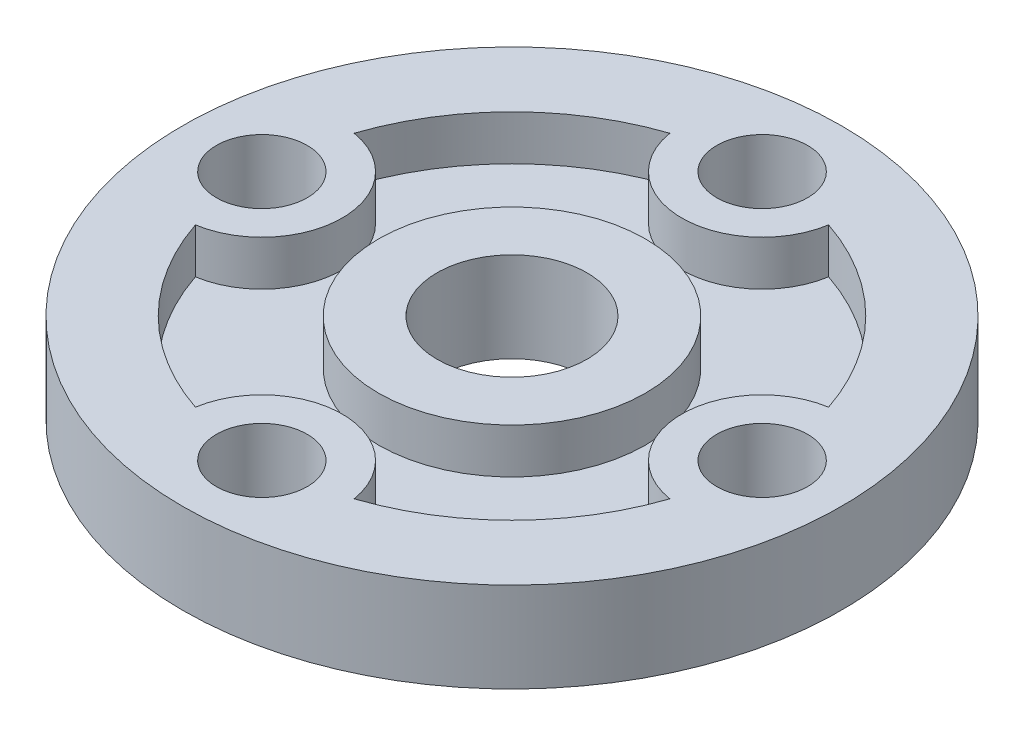
ISO-10303-21;
HEADER;
FILE_DESCRIPTION(('STEP AP214'),'2;1');
FILE_NAME('part.step','',(''),(''),'','','');
FILE_SCHEMA(('AUTOMOTIVE_DESIGN { 1 0 10303 214 1 1 1 1 }'));
ENDSEC;
DATA;
#1=APPLICATION_CONTEXT('core data for automotive mechanical design processes');
#2=APPLICATION_PROTOCOL_DEFINITION('international standard','automotive_design',2000,#1);
#3=PRODUCT_CONTEXT('',#1,'mechanical');
#4=PRODUCT('Part','Part','',(#3));
#5=PRODUCT_RELATED_PRODUCT_CATEGORY('part','',(#4));
#6=PRODUCT_DEFINITION_FORMATION('','',#4);
#7=PRODUCT_DEFINITION_CONTEXT('part definition',#1,'design');
#8=PRODUCT_DEFINITION('design','',#6,#7);
#9=PRODUCT_DEFINITION_SHAPE('','',#8);
#10=(LENGTH_UNIT() NAMED_UNIT(*) SI_UNIT(.MILLI.,.METRE.));
#11=(NAMED_UNIT(*) PLANE_ANGLE_UNIT() SI_UNIT($,.RADIAN.));
#12=(NAMED_UNIT(*) SI_UNIT($,.STERADIAN.) SOLID_ANGLE_UNIT());
#13=UNCERTAINTY_MEASURE_WITH_UNIT(LENGTH_MEASURE(1.E-05),#10,'distance_accuracy_value','');
#14=(GEOMETRIC_REPRESENTATION_CONTEXT(3) GLOBAL_UNCERTAINTY_ASSIGNED_CONTEXT((#13)) GLOBAL_UNIT_ASSIGNED_CONTEXT((#10,
#11,#12)) REPRESENTATION_CONTEXT('',''));
#15=CARTESIAN_POINT('',(0.,0.,0.));
#16=DIRECTION('',(0.,0.,1.));
#17=DIRECTION('',(1.,0.,0.));
#18=AXIS2_PLACEMENT_3D('',#15,#16,#17);
#19=CARTESIAN_POINT('',(0.,0.,0.));
#20=DIRECTION('',(0.,1.,0.));
#21=DIRECTION('',(0.,0.,1.));
#22=AXIS2_PLACEMENT_3D('',#19,#20,#21);
#23=PLANE('',#22);
#24=CARTESIAN_POINT('',(0.,0.,0.));
#25=DIRECTION('',(0.,1.,0.));
#26=DIRECTION('',(0.,0.,1.));
#27=AXIS2_PLACEMENT_3D('',#24,#25,#26);
#28=CIRCLE('',#27,73.2147527180181);
#29=CARTESIAN_POINT('',(0.,0.,73.2147527180181));
#30=VERTEX_POINT('',#29);
#31=EDGE_CURVE('E37',#30,#30,#28,.T.);
#32=ORIENTED_EDGE('',*,*,#31,.T.);
#33=EDGE_LOOP('',(#32));
#34=FACE_BOUND('',#33,.T.);
#35=CARTESIAN_POINT('',(-1.94042622247042E-13,0.,55.5760158555897));
#36=DIRECTION('',(0.,1.,0.));
#37=DIRECTION('',(0.,0.,1.));
#38=AXIS2_PLACEMENT_3D('',#35,#36,#37);
#39=CIRCLE('',#38,10.0889715448126);
#40=CARTESIAN_POINT('',(-1.94042622247042E-13,0.,65.6649874004024));
#41=VERTEX_POINT('',#40);
#42=EDGE_CURVE('E169',#41,#41,#39,.T.);
#43=ORIENTED_EDGE('',*,*,#42,.F.);
#44=EDGE_LOOP('',(#43));
#45=FACE_BOUND('',#44,.T.);
#46=CARTESIAN_POINT('',(55.5760158555897,0.,0.));
#47=DIRECTION('',(0.,1.,0.));
#48=DIRECTION('',(0.,0.,1.));
#49=AXIS2_PLACEMENT_3D('',#46,#47,#48);
#50=CIRCLE('',#49,10.0889715448126);
#51=CARTESIAN_POINT('',(55.5760158555897,0.,10.0889715448126));
#52=VERTEX_POINT('',#51);
#53=EDGE_CURVE('E162',#52,#52,#50,.T.);
#54=ORIENTED_EDGE('',*,*,#53,.F.);
#55=EDGE_LOOP('',(#54));
#56=FACE_BOUND('',#55,.T.);
#57=CARTESIAN_POINT('',(5.82127866741125E-13,0.,-55.5760158555897));
#58=DIRECTION('',(0.,1.,0.));
#59=DIRECTION('',(0.,0.,1.));
#60=AXIS2_PLACEMENT_3D('',#57,#58,#59);
#61=CIRCLE('',#60,10.0889715448126);
#62=CARTESIAN_POINT('',(5.82127866741125E-13,0.,-45.4870443107771));
#63=VERTEX_POINT('',#62);
#64=EDGE_CURVE('E181',#63,#63,#61,.T.);
#65=ORIENTED_EDGE('',*,*,#64,.F.);
#66=EDGE_LOOP('',(#65));
#67=FACE_BOUND('',#66,.T.);
#68=CARTESIAN_POINT('',(-55.5760158555897,0.,-3.88085244494083E-13));
#69=DIRECTION('',(0.,1.,0.));
#70=DIRECTION('',(0.,0.,1.));
#71=AXIS2_PLACEMENT_3D('',#68,#69,#70);
#72=CIRCLE('',#71,10.0889715448126);
#73=CARTESIAN_POINT('',(-55.5760158555897,0.,10.0889715448122));
#74=VERTEX_POINT('',#73);
#75=EDGE_CURVE('E174',#74,#74,#72,.T.);
#76=ORIENTED_EDGE('',*,*,#75,.F.);
#77=EDGE_LOOP('',(#76));
#78=FACE_BOUND('',#77,.T.);
#79=CARTESIAN_POINT('',(0.,0.,0.));
#80=DIRECTION('',(0.,1.,0.));
#81=DIRECTION('',(0.,0.,1.));
#82=AXIS2_PLACEMENT_3D('',#79,#80,#81);
#83=CIRCLE('',#82,55.5760158555897);
#84=CARTESIAN_POINT('',(-17.6352133480367,0.,-52.7038213846965));
#85=VERTEX_POINT('',#84);
#86=CARTESIAN_POINT('',(-52.7038213846962,0.,-17.6352133480376));
#87=VERTEX_POINT('',#86);
#88=EDGE_CURVE('E147',#85,#87,#83,.T.);
#89=ORIENTED_EDGE('',*,*,#88,.F.);
#90=CARTESIAN_POINT('',(5.82127866741125E-13,0.,-55.5760158555897));
#91=DIRECTION('',(0.,1.,0.));
#92=DIRECTION('',(0.,0.,1.));
#93=AXIS2_PLACEMENT_3D('',#90,#91,#92);
#94=CIRCLE('',#93,17.8675754065688);
#95=CARTESIAN_POINT('',(17.6352133480378,0.,-52.7038213846961));
#96=VERTEX_POINT('',#95);
#97=EDGE_CURVE('E48',#85,#96,#94,.T.);
#98=ORIENTED_EDGE('',*,*,#97,.T.);
#99=CARTESIAN_POINT('',(52.7038213846963,0.,-17.6352133480373));
#100=VERTEX_POINT('',#99);
#101=EDGE_CURVE('E141',#100,#96,#83,.T.);
#102=ORIENTED_EDGE('',*,*,#101,.F.);
#103=CARTESIAN_POINT('',(55.5760158555897,0.,0.));
#104=DIRECTION('',(0.,1.,0.));
#105=DIRECTION('',(0.,0.,1.));
#106=AXIS2_PLACEMENT_3D('',#103,#104,#105);
#107=CIRCLE('',#106,17.8675754065688);
#108=CARTESIAN_POINT('',(52.7038213846963,0.,17.6352133480373));
#109=VERTEX_POINT('',#108);
#110=EDGE_CURVE('E145',#100,#109,#107,.T.);
#111=ORIENTED_EDGE('',*,*,#110,.T.);
#112=CARTESIAN_POINT('',(17.6352133480371,0.,52.7038213846963));
#113=VERTEX_POINT('',#112);
#114=EDGE_CURVE('E117',#113,#109,#83,.T.);
#115=ORIENTED_EDGE('',*,*,#114,.F.);
#116=CARTESIAN_POINT('',(-1.94042622247042E-13,0.,55.5760158555897));
#117=DIRECTION('',(0.,1.,0.));
#118=DIRECTION('',(0.,0.,1.));
#119=AXIS2_PLACEMENT_3D('',#116,#117,#118);
#120=CIRCLE('',#119,17.8675754065688);
#121=CARTESIAN_POINT('',(-17.6352133480375,0.,52.7038213846962));
#122=VERTEX_POINT('',#121);
#123=EDGE_CURVE('E376',#113,#122,#120,.T.);
#124=ORIENTED_EDGE('',*,*,#123,.T.);
#125=CARTESIAN_POINT('',(-52.7038213846964,0.,17.6352133480369));
#126=VERTEX_POINT('',#125);
#127=EDGE_CURVE('E370',#126,#122,#83,.T.);
#128=ORIENTED_EDGE('',*,*,#127,.F.);
#129=CARTESIAN_POINT('',(-55.5760158555897,0.,-3.88085244494083E-13));
#130=DIRECTION('',(0.,1.,0.));
#131=DIRECTION('',(0.,0.,1.));
#132=AXIS2_PLACEMENT_3D('',#129,#130,#131);
#133=CIRCLE('',#132,17.8675754065688);
#134=EDGE_CURVE('E377',#126,#87,#133,.T.);
#135=ORIENTED_EDGE('',*,*,#134,.T.);
#136=EDGE_LOOP('',(#89,#98,#102,#111,#115,#124,#128,#135));
#137=FACE_BOUND('',#136,.T.);
#138=ADVANCED_FACE('F33',(#34,#45,#56,#67,#78,#137),#23,.T.);
#139=CARTESIAN_POINT('',(0.,0.,0.));
#140=DIRECTION('',(0.,1.,0.));
#141=DIRECTION('',(0.,0.,1.));
#142=AXIS2_PLACEMENT_3D('',#139,#140,#141);
#143=CIRCLE('',#142,16.6611074310264);
#144=CARTESIAN_POINT('',(0.,0.,16.6611074310264));
#145=VERTEX_POINT('',#144);
#146=EDGE_CURVE('E177',#145,#145,#143,.T.);
#147=ORIENTED_EDGE('',*,*,#146,.F.);
#148=EDGE_LOOP('',(#147));
#149=FACE_BOUND('',#148,.T.);
#150=CARTESIAN_POINT('',(0.,0.,0.));
#151=DIRECTION('',(0.,1.,0.));
#152=DIRECTION('',(0.,0.,1.));
#153=AXIS2_PLACEMENT_3D('',#150,#151,#152);
#154=CIRCLE('',#153,29.6677073443288);
#155=CARTESIAN_POINT('',(0.,0.,29.6677073443288));
#156=VERTEX_POINT('',#155);
#157=EDGE_CURVE('E139',#156,#156,#154,.T.);
#158=ORIENTED_EDGE('',*,*,#157,.T.);
#159=EDGE_LOOP('',(#158));
#160=FACE_BOUND('',#159,.T.);
#161=ADVANCED_FACE('F194',(#149,#160),#23,.T.);
#162=CARTESIAN_POINT('',(0.,-20.,0.));
#163=DIRECTION('',(0.,1.,0.));
#164=DIRECTION('',(0.,0.,1.));
#165=AXIS2_PLACEMENT_3D('',#162,#163,#164);
#166=CYLINDRICAL_SURFACE('',#165,73.2147527180181);
#167=CARTESIAN_POINT('',(0.,-20.,0.));
#168=DIRECTION('',(0.,1.,0.));
#169=DIRECTION('',(0.,0.,1.));
#170=AXIS2_PLACEMENT_3D('',#167,#168,#169);
#171=CIRCLE('',#170,73.2147527180181);
#172=CARTESIAN_POINT('',(0.,-20.,73.2147527180181));
#173=VERTEX_POINT('',#172);
#174=EDGE_CURVE('E11',#173,#173,#171,.T.);
#175=ORIENTED_EDGE('',*,*,#174,.T.);
#176=EDGE_LOOP('',(#175));
#177=FACE_BOUND('',#176,.T.);
#178=ORIENTED_EDGE('',*,*,#31,.F.);
#179=EDGE_LOOP('',(#178));
#180=FACE_BOUND('',#179,.T.);
#181=ADVANCED_FACE('F35',(#177,#180),#166,.T.);
#182=CARTESIAN_POINT('',(0.,-20.,0.));
#183=DIRECTION('',(0.,1.,0.));
#184=DIRECTION('',(0.,0.,1.));
#185=AXIS2_PLACEMENT_3D('',#182,#183,#184);
#186=PLANE('',#185);
#187=CARTESIAN_POINT('',(-55.5760158555897,-20.,-3.88085244494083E-13));
#188=DIRECTION('',(0.,1.,0.));
#189=DIRECTION('',(0.,0.,1.));
#190=AXIS2_PLACEMENT_3D('',#187,#188,#189);
#191=CIRCLE('',#190,10.0889715448126);
#192=CARTESIAN_POINT('',(-55.5760158555897,-20.,10.0889715448122));
#193=VERTEX_POINT('',#192);
#194=EDGE_CURVE('E178',#193,#193,#191,.T.);
#195=ORIENTED_EDGE('',*,*,#194,.T.);
#196=EDGE_LOOP('',(#195));
#197=FACE_BOUND('',#196,.T.);
#198=CARTESIAN_POINT('',(5.82127866741125E-13,-20.,-55.5760158555897));
#199=DIRECTION('',(0.,1.,0.));
#200=DIRECTION('',(0.,0.,1.));
#201=AXIS2_PLACEMENT_3D('',#198,#199,#200);
#202=CIRCLE('',#201,10.0889715448126);
#203=CARTESIAN_POINT('',(5.82127866741125E-13,-20.,-45.4870443107771));
#204=VERTEX_POINT('',#203);
#205=EDGE_CURVE('E165',#204,#204,#202,.T.);
#206=ORIENTED_EDGE('',*,*,#205,.T.);
#207=EDGE_LOOP('',(#206));
#208=FACE_BOUND('',#207,.T.);
#209=CARTESIAN_POINT('',(55.5760158555897,-20.,0.));
#210=DIRECTION('',(0.,1.,0.));
#211=DIRECTION('',(0.,0.,1.));
#212=AXIS2_PLACEMENT_3D('',#209,#210,#211);
#213=CIRCLE('',#212,10.0889715448126);
#214=CARTESIAN_POINT('',(55.5760158555897,-20.,10.0889715448126));
#215=VERTEX_POINT('',#214);
#216=EDGE_CURVE('E166',#215,#215,#213,.T.);
#217=ORIENTED_EDGE('',*,*,#216,.T.);
#218=EDGE_LOOP('',(#217));
#219=FACE_BOUND('',#218,.T.);
#220=CARTESIAN_POINT('',(-1.94042622247042E-13,-20.,55.5760158555897));
#221=DIRECTION('',(0.,1.,0.));
#222=DIRECTION('',(0.,0.,1.));
#223=AXIS2_PLACEMENT_3D('',#220,#221,#222);
#224=CIRCLE('',#223,10.0889715448126);
#225=CARTESIAN_POINT('',(-1.94042622247042E-13,-20.,65.6649874004024));
#226=VERTEX_POINT('',#225);
#227=EDGE_CURVE('E152',#226,#226,#224,.T.);
#228=ORIENTED_EDGE('',*,*,#227,.T.);
#229=EDGE_LOOP('',(#228));
#230=FACE_BOUND('',#229,.T.);
#231=CARTESIAN_POINT('',(0.,-20.,0.));
#232=DIRECTION('',(0.,1.,0.));
#233=DIRECTION('',(0.,0.,1.));
#234=AXIS2_PLACEMENT_3D('',#231,#232,#233);
#235=CIRCLE('',#234,16.6611074310264);
#236=CARTESIAN_POINT('',(0.,-20.,16.6611074310264));
#237=VERTEX_POINT('',#236);
#238=EDGE_CURVE('E186',#237,#237,#235,.T.);
#239=ORIENTED_EDGE('',*,*,#238,.T.);
#240=EDGE_LOOP('',(#239));
#241=FACE_BOUND('',#240,.T.);
#242=ORIENTED_EDGE('',*,*,#174,.F.);
#243=EDGE_LOOP('',(#242));
#244=FACE_BOUND('',#243,.T.);
#245=ADVANCED_FACE('F200',(#197,#208,#219,#230,#241,#244),#186,.F.);
#246=CARTESIAN_POINT('',(0.,-20.,0.));
#247=DIRECTION('',(0.,1.,0.));
#248=DIRECTION('',(0.,0.,1.));
#249=AXIS2_PLACEMENT_3D('',#246,#247,#248);
#250=CYLINDRICAL_SURFACE('',#249,16.6611074310264);
#251=ORIENTED_EDGE('',*,*,#238,.F.);
#252=EDGE_LOOP('',(#251));
#253=FACE_BOUND('',#252,.T.);
#254=ORIENTED_EDGE('',*,*,#146,.T.);
#255=EDGE_LOOP('',(#254));
#256=FACE_BOUND('',#255,.T.);
#257=ADVANCED_FACE('F192',(#253,#256),#250,.F.);
#258=CARTESIAN_POINT('',(-1.94042622247042E-13,-20.,55.5760158555897));
#259=DIRECTION('',(0.,1.,0.));
#260=DIRECTION('',(0.,0.,1.));
#261=AXIS2_PLACEMENT_3D('',#258,#259,#260);
#262=CYLINDRICAL_SURFACE('',#261,10.0889715448126);
#263=ORIENTED_EDGE('',*,*,#227,.F.);
#264=EDGE_LOOP('',(#263));
#265=FACE_BOUND('',#264,.T.);
#266=ORIENTED_EDGE('',*,*,#42,.T.);
#267=EDGE_LOOP('',(#266));
#268=FACE_BOUND('',#267,.T.);
#269=ADVANCED_FACE('F209',(#265,#268),#262,.F.);
#270=CARTESIAN_POINT('',(55.5760158555897,-20.,0.));
#271=DIRECTION('',(0.,1.,0.));
#272=DIRECTION('',(0.,0.,1.));
#273=AXIS2_PLACEMENT_3D('',#270,#271,#272);
#274=CYLINDRICAL_SURFACE('',#273,10.0889715448126);
#275=ORIENTED_EDGE('',*,*,#216,.F.);
#276=EDGE_LOOP('',(#275));
#277=FACE_BOUND('',#276,.T.);
#278=ORIENTED_EDGE('',*,*,#53,.T.);
#279=EDGE_LOOP('',(#278));
#280=FACE_BOUND('',#279,.T.);
#281=ADVANCED_FACE('F215',(#277,#280),#274,.F.);
#282=CARTESIAN_POINT('',(5.82127866741125E-13,-20.,-55.5760158555897));
#283=DIRECTION('',(0.,1.,0.));
#284=DIRECTION('',(0.,0.,1.));
#285=AXIS2_PLACEMENT_3D('',#282,#283,#284);
#286=CYLINDRICAL_SURFACE('',#285,10.0889715448126);
#287=ORIENTED_EDGE('',*,*,#205,.F.);
#288=EDGE_LOOP('',(#287));
#289=FACE_BOUND('',#288,.T.);
#290=ORIENTED_EDGE('',*,*,#64,.T.);
#291=EDGE_LOOP('',(#290));
#292=FACE_BOUND('',#291,.T.);
#293=ADVANCED_FACE('F211',(#289,#292),#286,.F.);
#294=CARTESIAN_POINT('',(-55.5760158555897,-20.,-3.88085244494083E-13));
#295=DIRECTION('',(0.,1.,0.));
#296=DIRECTION('',(0.,0.,1.));
#297=AXIS2_PLACEMENT_3D('',#294,#295,#296);
#298=CYLINDRICAL_SURFACE('',#297,10.0889715448126);
#299=ORIENTED_EDGE('',*,*,#194,.F.);
#300=EDGE_LOOP('',(#299));
#301=FACE_BOUND('',#300,.T.);
#302=ORIENTED_EDGE('',*,*,#75,.T.);
#303=EDGE_LOOP('',(#302));
#304=FACE_BOUND('',#303,.T.);
#305=ADVANCED_FACE('F214',(#301,#304),#298,.F.);
#306=CARTESIAN_POINT('',(5.82127866741125E-13,-10.,-55.5760158555897));
#307=DIRECTION('',(0.,1.,0.));
#308=DIRECTION('',(0.,0.,1.));
#309=AXIS2_PLACEMENT_3D('',#306,#307,#308);
#310=CYLINDRICAL_SURFACE('',#309,17.8675754065688);
#311=ORIENTED_EDGE('',*,*,#97,.F.);
#312=DIRECTION('',(0.,1.,0.));
#313=VECTOR('',#312,1.);
#314=CARTESIAN_POINT('',(-17.6352133480367,-10.,-52.7038213846965));
#315=LINE('',#314,#313);
#316=CARTESIAN_POINT('',(-17.6352133480367,-10.,-52.7038213846965));
#317=VERTEX_POINT('',#316);
#318=EDGE_CURVE('E84',#317,#85,#315,.T.);
#319=ORIENTED_EDGE('',*,*,#318,.F.);
#320=CARTESIAN_POINT('',(5.82127866741125E-13,-10.,-55.5760158555897));
#321=DIRECTION('',(0.,1.,0.));
#322=DIRECTION('',(0.,0.,1.));
#323=AXIS2_PLACEMENT_3D('',#320,#321,#322);
#324=CIRCLE('',#323,17.8675754065688);
#325=CARTESIAN_POINT('',(17.6352133480378,-10.,-52.7038213846961));
#326=VERTEX_POINT('',#325);
#327=EDGE_CURVE('E54',#317,#326,#324,.T.);
#328=ORIENTED_EDGE('',*,*,#327,.T.);
#329=DIRECTION('',(0.,1.,0.));
#330=VECTOR('',#329,1.);
#331=CARTESIAN_POINT('',(17.6352133480378,-10.,-52.7038213846961));
#332=LINE('',#331,#330);
#333=EDGE_CURVE('E80',#326,#96,#332,.T.);
#334=ORIENTED_EDGE('',*,*,#333,.T.);
#335=EDGE_LOOP('',(#311,#319,#328,#334));
#336=FACE_BOUND('',#335,.T.);
#337=ADVANCED_FACE('F219',(#336),#310,.T.);
#338=CARTESIAN_POINT('',(0.,-10.,0.));
#339=DIRECTION('',(0.,1.,0.));
#340=DIRECTION('',(0.,0.,1.));
#341=AXIS2_PLACEMENT_3D('',#338,#339,#340);
#342=CYLINDRICAL_SURFACE('',#341,55.5760158555897);
#343=ORIENTED_EDGE('',*,*,#101,.T.);
#344=ORIENTED_EDGE('',*,*,#333,.F.);
#345=CARTESIAN_POINT('',(0.,-10.,0.));
#346=DIRECTION('',(0.,1.,0.));
#347=DIRECTION('',(0.,0.,1.));
#348=AXIS2_PLACEMENT_3D('',#345,#346,#347);
#349=CIRCLE('',#348,55.5760158555897);
#350=CARTESIAN_POINT('',(52.7038213846963,-10.,-17.6352133480373));
#351=VERTEX_POINT('',#350);
#352=EDGE_CURVE('E110',#351,#326,#349,.T.);
#353=ORIENTED_EDGE('',*,*,#352,.F.);
#354=DIRECTION('',(0.,1.,0.));
#355=VECTOR('',#354,1.);
#356=CARTESIAN_POINT('',(52.7038213846963,-10.,-17.6352133480373));
#357=LINE('',#356,#355);
#358=EDGE_CURVE('E105',#351,#100,#357,.T.);
#359=ORIENTED_EDGE('',*,*,#358,.T.);
#360=EDGE_LOOP('',(#343,#344,#353,#359));
#361=FACE_BOUND('',#360,.T.);
#362=ADVANCED_FACE('F229',(#361),#342,.F.);
#363=CARTESIAN_POINT('',(55.5760158555897,-10.,0.));
#364=DIRECTION('',(0.,1.,0.));
#365=DIRECTION('',(0.,0.,1.));
#366=AXIS2_PLACEMENT_3D('',#363,#364,#365);
#367=CYLINDRICAL_SURFACE('',#366,17.8675754065688);
#368=ORIENTED_EDGE('',*,*,#110,.F.);
#369=ORIENTED_EDGE('',*,*,#358,.F.);
#370=CARTESIAN_POINT('',(55.5760158555897,-10.,0.));
#371=DIRECTION('',(0.,1.,0.));
#372=DIRECTION('',(0.,0.,1.));
#373=AXIS2_PLACEMENT_3D('',#370,#371,#372);
#374=CIRCLE('',#373,17.8675754065688);
#375=CARTESIAN_POINT('',(52.7038213846963,-10.,17.6352133480373));
#376=VERTEX_POINT('',#375);
#377=EDGE_CURVE('E99',#351,#376,#374,.T.);
#378=ORIENTED_EDGE('',*,*,#377,.T.);
#379=DIRECTION('',(0.,1.,0.));
#380=VECTOR('',#379,1.);
#381=CARTESIAN_POINT('',(52.7038213846963,-10.,17.6352133480373));
#382=LINE('',#381,#380);
#383=EDGE_CURVE('E103',#376,#109,#382,.T.);
#384=ORIENTED_EDGE('',*,*,#383,.T.);
#385=EDGE_LOOP('',(#368,#369,#378,#384));
#386=FACE_BOUND('',#385,.T.);
#387=ADVANCED_FACE('F102',(#386),#367,.T.);
#388=ORIENTED_EDGE('',*,*,#114,.T.);
#389=ORIENTED_EDGE('',*,*,#383,.F.);
#390=CARTESIAN_POINT('',(17.6352133480371,-10.,52.7038213846963));
#391=VERTEX_POINT('',#390);
#392=EDGE_CURVE('E111',#391,#376,#349,.T.);
#393=ORIENTED_EDGE('',*,*,#392,.F.);
#394=DIRECTION('',(0.,1.,0.));
#395=VECTOR('',#394,1.);
#396=CARTESIAN_POINT('',(17.6352133480371,-10.,52.7038213846963));
#397=LINE('',#396,#395);
#398=EDGE_CURVE('E119',#391,#113,#397,.T.);
#399=ORIENTED_EDGE('',*,*,#398,.T.);
#400=EDGE_LOOP('',(#388,#389,#393,#399));
#401=FACE_BOUND('',#400,.T.);
#402=ADVANCED_FACE('F115',(#401),#342,.F.);
#403=CARTESIAN_POINT('',(-1.94042622247042E-13,-10.,55.5760158555897));
#404=DIRECTION('',(0.,1.,0.));
#405=DIRECTION('',(0.,0.,1.));
#406=AXIS2_PLACEMENT_3D('',#403,#404,#405);
#407=CYLINDRICAL_SURFACE('',#406,17.8675754065688);
#408=ORIENTED_EDGE('',*,*,#123,.F.);
#409=ORIENTED_EDGE('',*,*,#398,.F.);
#410=CARTESIAN_POINT('',(-1.94042622247042E-13,-10.,55.5760158555897));
#411=DIRECTION('',(0.,1.,0.));
#412=DIRECTION('',(0.,0.,1.));
#413=AXIS2_PLACEMENT_3D('',#410,#411,#412);
#414=CIRCLE('',#413,17.8675754065688);
#415=CARTESIAN_POINT('',(-17.6352133480375,-10.,52.7038213846962));
#416=VERTEX_POINT('',#415);
#417=EDGE_CURVE('E125',#391,#416,#414,.T.);
#418=ORIENTED_EDGE('',*,*,#417,.T.);
#419=DIRECTION('',(0.,1.,0.));
#420=VECTOR('',#419,1.);
#421=CARTESIAN_POINT('',(-17.6352133480375,-10.,52.7038213846962));
#422=LINE('',#421,#420);
#423=EDGE_CURVE('E155',#416,#122,#422,.T.);
#424=ORIENTED_EDGE('',*,*,#423,.T.);
#425=EDGE_LOOP('',(#408,#409,#418,#424));
#426=FACE_BOUND('',#425,.T.);
#427=ADVANCED_FACE('F236',(#426),#407,.T.);
#428=ORIENTED_EDGE('',*,*,#127,.T.);
#429=ORIENTED_EDGE('',*,*,#423,.F.);
#430=CARTESIAN_POINT('',(-52.7038213846964,-10.,17.6352133480369));
#431=VERTEX_POINT('',#430);
#432=EDGE_CURVE('E127',#431,#416,#349,.T.);
#433=ORIENTED_EDGE('',*,*,#432,.F.);
#434=DIRECTION('',(0.,1.,0.));
#435=VECTOR('',#434,1.);
#436=CARTESIAN_POINT('',(-52.7038213846964,-10.,17.6352133480369));
#437=LINE('',#436,#435);
#438=EDGE_CURVE('E157',#431,#126,#437,.T.);
#439=ORIENTED_EDGE('',*,*,#438,.T.);
#440=EDGE_LOOP('',(#428,#429,#433,#439));
#441=FACE_BOUND('',#440,.T.);
#442=ADVANCED_FACE('F234',(#441),#342,.F.);
#443=CARTESIAN_POINT('',(-55.5760158555897,-10.,-3.88085244494083E-13));
#444=DIRECTION('',(0.,1.,0.));
#445=DIRECTION('',(0.,0.,1.));
#446=AXIS2_PLACEMENT_3D('',#443,#444,#445);
#447=CYLINDRICAL_SURFACE('',#446,17.8675754065688);
#448=ORIENTED_EDGE('',*,*,#134,.F.);
#449=ORIENTED_EDGE('',*,*,#438,.F.);
#450=CARTESIAN_POINT('',(-55.5760158555897,-10.,-3.88085244494083E-13));
#451=DIRECTION('',(0.,1.,0.));
#452=DIRECTION('',(0.,0.,1.));
#453=AXIS2_PLACEMENT_3D('',#450,#451,#452);
#454=CIRCLE('',#453,17.8675754065688);
#455=CARTESIAN_POINT('',(-52.7038213846962,-10.,-17.6352133480376));
#456=VERTEX_POINT('',#455);
#457=EDGE_CURVE('E132',#431,#456,#454,.T.);
#458=ORIENTED_EDGE('',*,*,#457,.T.);
#459=DIRECTION('',(0.,1.,0.));
#460=VECTOR('',#459,1.);
#461=CARTESIAN_POINT('',(-52.7038213846962,-10.,-17.6352133480376));
#462=LINE('',#461,#460);
#463=EDGE_CURVE('E159',#456,#87,#462,.T.);
#464=ORIENTED_EDGE('',*,*,#463,.T.);
#465=EDGE_LOOP('',(#448,#449,#458,#464));
#466=FACE_BOUND('',#465,.T.);
#467=ADVANCED_FACE('F230',(#466),#447,.T.);
#468=ORIENTED_EDGE('',*,*,#88,.T.);
#469=ORIENTED_EDGE('',*,*,#463,.F.);
#470=EDGE_CURVE('E129',#317,#456,#349,.T.);
#471=ORIENTED_EDGE('',*,*,#470,.F.);
#472=ORIENTED_EDGE('',*,*,#318,.T.);
#473=EDGE_LOOP('',(#468,#469,#471,#472));
#474=FACE_BOUND('',#473,.T.);
#475=ADVANCED_FACE('F233',(#474),#342,.F.);
#476=CARTESIAN_POINT('',(0.,-10.,0.));
#477=DIRECTION('',(0.,1.,0.));
#478=DIRECTION('',(0.,0.,1.));
#479=AXIS2_PLACEMENT_3D('',#476,#477,#478);
#480=CYLINDRICAL_SURFACE('',#479,29.6677073443288);
#481=CARTESIAN_POINT('',(0.,-10.,0.));
#482=DIRECTION('',(0.,1.,0.));
#483=DIRECTION('',(0.,0.,1.));
#484=AXIS2_PLACEMENT_3D('',#481,#482,#483);
#485=CIRCLE('',#484,29.6677073443288);
#486=CARTESIAN_POINT('',(0.,-10.,29.6677073443288));
#487=VERTEX_POINT('',#486);
#488=EDGE_CURVE('E133',#487,#487,#485,.T.);
#489=ORIENTED_EDGE('',*,*,#488,.T.);
#490=EDGE_LOOP('',(#489));
#491=FACE_BOUND('',#490,.T.);
#492=ORIENTED_EDGE('',*,*,#157,.F.);
#493=EDGE_LOOP('',(#492));
#494=FACE_BOUND('',#493,.T.);
#495=ADVANCED_FACE('F245',(#491,#494),#480,.T.);
#496=CARTESIAN_POINT('',(0.,-10.,0.));
#497=DIRECTION('',(0.,1.,0.));
#498=DIRECTION('',(0.,0.,1.));
#499=AXIS2_PLACEMENT_3D('',#496,#497,#498);
#500=PLANE('',#499);
#501=ORIENTED_EDGE('',*,*,#327,.F.);
#502=ORIENTED_EDGE('',*,*,#470,.T.);
#503=ORIENTED_EDGE('',*,*,#457,.F.);
#504=ORIENTED_EDGE('',*,*,#432,.T.);
#505=ORIENTED_EDGE('',*,*,#417,.F.);
#506=ORIENTED_EDGE('',*,*,#392,.T.);
#507=ORIENTED_EDGE('',*,*,#377,.F.);
#508=ORIENTED_EDGE('',*,*,#352,.T.);
#509=EDGE_LOOP('',(#501,#502,#503,#504,#505,#506,#507,#508));
#510=FACE_BOUND('',#509,.T.);
#511=ORIENTED_EDGE('',*,*,#488,.F.);
#512=EDGE_LOOP('',(#511));
#513=FACE_BOUND('',#512,.T.);
#514=ADVANCED_FACE('F122',(#510,#513),#500,.T.);
#515=CLOSED_SHELL('',(#138,#161,#181,#245,#257,#269,#281,#293,#305,#337,#362,#387,#402,#427,
#442,#467,#475,#495,#514));
#516=MANIFOLD_SOLID_BREP('B2',#515);
#517=ADVANCED_BREP_SHAPE_REPRESENTATION('',(#18,#516),#14);
#518=SHAPE_DEFINITION_REPRESENTATION(#9,#517);
ENDSEC;
END-ISO-10303-21;
